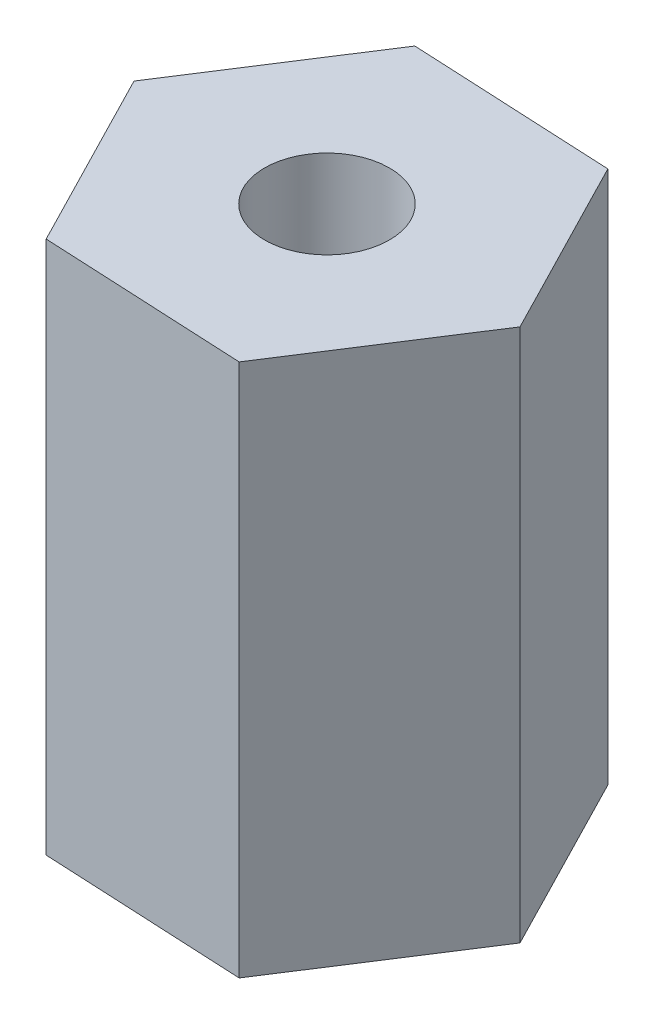
ISO-10303-21;
HEADER;
FILE_DESCRIPTION(('STEP AP214'),'2;1');
FILE_NAME('part.step','',(''),(''),'','','');
FILE_SCHEMA(('AUTOMOTIVE_DESIGN { 1 0 10303 214 1 1 1 1 }'));
ENDSEC;
DATA;
#1=APPLICATION_CONTEXT('core data for automotive mechanical design processes');
#2=APPLICATION_PROTOCOL_DEFINITION('international standard','automotive_design',2000,#1);
#3=PRODUCT_CONTEXT('',#1,'mechanical');
#4=PRODUCT('Part','Part','',(#3));
#5=PRODUCT_RELATED_PRODUCT_CATEGORY('part','',(#4));
#6=PRODUCT_DEFINITION_FORMATION('','',#4);
#7=PRODUCT_DEFINITION_CONTEXT('part definition',#1,'design');
#8=PRODUCT_DEFINITION('design','',#6,#7);
#9=PRODUCT_DEFINITION_SHAPE('','',#8);
#10=(LENGTH_UNIT() NAMED_UNIT(*) SI_UNIT(.MILLI.,.METRE.));
#11=(NAMED_UNIT(*) PLANE_ANGLE_UNIT() SI_UNIT($,.RADIAN.));
#12=(NAMED_UNIT(*) SI_UNIT($,.STERADIAN.) SOLID_ANGLE_UNIT());
#13=UNCERTAINTY_MEASURE_WITH_UNIT(LENGTH_MEASURE(1.E-05),#10,'distance_accuracy_value','');
#14=(GEOMETRIC_REPRESENTATION_CONTEXT(3) GLOBAL_UNCERTAINTY_ASSIGNED_CONTEXT((#13)) GLOBAL_UNIT_ASSIGNED_CONTEXT((#10,
#11,#12)) REPRESENTATION_CONTEXT('',''));
#15=CARTESIAN_POINT('',(0.,0.,0.));
#16=DIRECTION('',(0.,0.,1.));
#17=DIRECTION('',(1.,0.,0.));
#18=AXIS2_PLACEMENT_3D('',#15,#16,#17);
#19=CARTESIAN_POINT('',(1.93898368371843,9.4,-3.00893263593705));
#20=DIRECTION('',(-0.0488166813838843,0.,0.998807755085364));
#21=DIRECTION('',(0.998807755085364,0.,0.0488166813838843));
#22=AXIS2_PLACEMENT_3D('',#19,#20,#21);
#23=PLANE('',#22);
#24=DIRECTION('',(-0.998807755085364,0.,-0.0488166813838843));
#25=VECTOR('',#24,1.);
#26=CARTESIAN_POINT('',(1.93898368371843,0.,-3.00893263593705));
#27=LINE('',#26,#25);
#28=CARTESIAN_POINT('',(1.93898368371843,0.,-3.00893263593705));
#29=VERTEX_POINT('',#28);
#30=CARTESIAN_POINT('',(-1.63632025913834,0.,-3.18367544559221));
#31=VERTEX_POINT('',#30);
#32=EDGE_CURVE('E117',#29,#31,#27,.T.);
#33=ORIENTED_EDGE('',*,*,#32,.T.);
#34=DIRECTION('',(0.,-1.,0.));
#35=VECTOR('',#34,1.);
#36=CARTESIAN_POINT('',(-1.63632025913834,9.4,-3.18367544559221));
#37=LINE('',#36,#35);
#38=CARTESIAN_POINT('',(-1.63632025913834,9.4,-3.18367544559221));
#39=VERTEX_POINT('',#38);
#40=EDGE_CURVE('E11',#39,#31,#37,.T.);
#41=ORIENTED_EDGE('',*,*,#40,.F.);
#42=DIRECTION('',(-0.998807755085364,0.,-0.0488166813838843));
#43=VECTOR('',#42,1.);
#44=CARTESIAN_POINT('',(1.93898368371843,9.4,-3.00893263593705));
#45=LINE('',#44,#43);
#46=CARTESIAN_POINT('',(1.93898368371843,9.4,-3.00893263593705));
#47=VERTEX_POINT('',#46);
#48=EDGE_CURVE('E128',#47,#39,#45,.T.);
#49=ORIENTED_EDGE('',*,*,#48,.F.);
#50=DIRECTION('',(0.,-1.,0.));
#51=VECTOR('',#50,1.);
#52=CARTESIAN_POINT('',(1.93898368371843,9.4,-3.00893263593705));
#53=LINE('',#52,#51);
#54=EDGE_CURVE('E113',#47,#29,#53,.T.);
#55=ORIENTED_EDGE('',*,*,#54,.T.);
#56=EDGE_LOOP('',(#33,#41,#49,#55));
#57=FACE_BOUND('',#56,.T.);
#58=ADVANCED_FACE('F33',(#57),#23,.F.);
#59=CARTESIAN_POINT('',(-1.63632025913834,9.4,-3.18367544559221));
#60=DIRECTION('',(0.840584548708889,0.,0.541680363749577));
#61=DIRECTION('',(0.541680363749577,0.,-0.840584548708889));
#62=AXIS2_PLACEMENT_3D('',#59,#60,#61);
#63=PLANE('',#62);
#64=DIRECTION('',(-0.541680363749577,0.,0.840584548708889));
#65=VECTOR('',#64,1.);
#66=CARTESIAN_POINT('',(-1.63632025913834,0.,-3.18367544559221));
#67=LINE('',#66,#65);
#68=CARTESIAN_POINT('',(-3.57530394285677,0.,-0.174742809655165));
#69=VERTEX_POINT('',#68);
#70=EDGE_CURVE('E120',#31,#69,#67,.T.);
#71=ORIENTED_EDGE('',*,*,#70,.T.);
#72=DIRECTION('',(0.,-1.,0.));
#73=VECTOR('',#72,1.);
#74=CARTESIAN_POINT('',(-3.57530394285677,9.4,-0.174742809655165));
#75=LINE('',#74,#73);
#76=CARTESIAN_POINT('',(-3.57530394285677,9.4,-0.174742809655165));
#77=VERTEX_POINT('',#76);
#78=EDGE_CURVE('E41',#77,#69,#75,.T.);
#79=ORIENTED_EDGE('',*,*,#78,.F.);
#80=DIRECTION('',(-0.541680363749577,0.,0.840584548708889));
#81=VECTOR('',#80,1.);
#82=CARTESIAN_POINT('',(-1.63632025913834,9.4,-3.18367544559221));
#83=LINE('',#82,#81);
#84=EDGE_CURVE('E86',#39,#77,#83,.T.);
#85=ORIENTED_EDGE('',*,*,#84,.F.);
#86=ORIENTED_EDGE('',*,*,#40,.T.);
#87=EDGE_LOOP('',(#71,#79,#85,#86));
#88=FACE_BOUND('',#87,.T.);
#89=ADVANCED_FACE('F153',(#88),#63,.F.);
#90=CARTESIAN_POINT('',(-3.57530394285677,9.4,-0.174742809655165));
#91=DIRECTION('',(0.889401230092773,0.,-0.457127391335787));
#92=DIRECTION('',(-0.457127391335787,0.,-0.889401230092773));
#93=AXIS2_PLACEMENT_3D('',#90,#91,#92);
#94=PLANE('',#93);
#95=DIRECTION('',(0.457127391335787,0.,0.889401230092773));
#96=VECTOR('',#95,1.);
#97=CARTESIAN_POINT('',(-3.57530394285677,0.,-0.174742809655165));
#98=LINE('',#97,#96);
#99=CARTESIAN_POINT('',(-1.93898368371843,0.,3.00893263593705));
#100=VERTEX_POINT('',#99);
#101=EDGE_CURVE('E123',#69,#100,#98,.T.);
#102=ORIENTED_EDGE('',*,*,#101,.T.);
#103=DIRECTION('',(0.,-1.,0.));
#104=VECTOR('',#103,1.);
#105=CARTESIAN_POINT('',(-1.93898368371843,9.4,3.00893263593705));
#106=LINE('',#105,#104);
#107=CARTESIAN_POINT('',(-1.93898368371843,9.4,3.00893263593705));
#108=VERTEX_POINT('',#107);
#109=EDGE_CURVE('E108',#108,#100,#106,.T.);
#110=ORIENTED_EDGE('',*,*,#109,.F.);
#111=DIRECTION('',(0.457127391335787,0.,0.889401230092773));
#112=VECTOR('',#111,1.);
#113=CARTESIAN_POINT('',(-3.57530394285677,9.4,-0.174742809655165));
#114=LINE('',#113,#112);
#115=EDGE_CURVE('E99',#77,#108,#114,.T.);
#116=ORIENTED_EDGE('',*,*,#115,.F.);
#117=ORIENTED_EDGE('',*,*,#78,.T.);
#118=EDGE_LOOP('',(#102,#110,#116,#117));
#119=FACE_BOUND('',#118,.T.);
#120=ADVANCED_FACE('F134',(#119),#94,.F.);
#121=CARTESIAN_POINT('',(-1.93898368371843,9.4,3.00893263593705));
#122=DIRECTION('',(0.0488166813838845,0.,-0.998807755085364));
#123=DIRECTION('',(-0.998807755085364,0.,-0.0488166813838845));
#124=AXIS2_PLACEMENT_3D('',#121,#122,#123);
#125=PLANE('',#124);
#126=DIRECTION('',(0.998807755085364,0.,0.0488166813838845));
#127=VECTOR('',#126,1.);
#128=CARTESIAN_POINT('',(-1.93898368371843,0.,3.00893263593705));
#129=LINE('',#128,#127);
#130=CARTESIAN_POINT('',(1.63632025913834,0.,3.18367544559221));
#131=VERTEX_POINT('',#130);
#132=EDGE_CURVE('E107',#100,#131,#129,.T.);
#133=ORIENTED_EDGE('',*,*,#132,.T.);
#134=DIRECTION('',(0.,-1.,0.));
#135=VECTOR('',#134,1.);
#136=CARTESIAN_POINT('',(1.63632025913834,9.4,3.18367544559221));
#137=LINE('',#136,#135);
#138=CARTESIAN_POINT('',(1.63632025913834,9.4,3.18367544559221));
#139=VERTEX_POINT('',#138);
#140=EDGE_CURVE('E104',#139,#131,#137,.T.);
#141=ORIENTED_EDGE('',*,*,#140,.F.);
#142=DIRECTION('',(0.998807755085364,0.,0.0488166813838845));
#143=VECTOR('',#142,1.);
#144=CARTESIAN_POINT('',(-1.93898368371843,9.4,3.00893263593705));
#145=LINE('',#144,#143);
#146=EDGE_CURVE('E93',#108,#139,#145,.T.);
#147=ORIENTED_EDGE('',*,*,#146,.F.);
#148=ORIENTED_EDGE('',*,*,#109,.T.);
#149=EDGE_LOOP('',(#133,#141,#147,#148));
#150=FACE_BOUND('',#149,.T.);
#151=ADVANCED_FACE('F105',(#150),#125,.F.);
#152=CARTESIAN_POINT('',(1.63632025913834,9.4,3.18367544559221));
#153=DIRECTION('',(-0.840584548708889,0.,-0.541680363749577));
#154=DIRECTION('',(-0.541680363749577,0.,0.840584548708889));
#155=AXIS2_PLACEMENT_3D('',#152,#153,#154);
#156=PLANE('',#155);
#157=DIRECTION('',(0.541680363749577,0.,-0.840584548708889));
#158=VECTOR('',#157,1.);
#159=CARTESIAN_POINT('',(1.63632025913834,0.,3.18367544559221));
#160=LINE('',#159,#158);
#161=CARTESIAN_POINT('',(3.57530394285677,0.,0.174742809655165));
#162=VERTEX_POINT('',#161);
#163=EDGE_CURVE('E72',#131,#162,#160,.T.);
#164=ORIENTED_EDGE('',*,*,#163,.T.);
#165=DIRECTION('',(0.,-1.,0.));
#166=VECTOR('',#165,1.);
#167=CARTESIAN_POINT('',(3.57530394285677,9.4,0.174742809655165));
#168=LINE('',#167,#166);
#169=CARTESIAN_POINT('',(3.57530394285677,9.4,0.174742809655165));
#170=VERTEX_POINT('',#169);
#171=EDGE_CURVE('E109',#170,#162,#168,.T.);
#172=ORIENTED_EDGE('',*,*,#171,.F.);
#173=DIRECTION('',(0.541680363749577,0.,-0.840584548708889));
#174=VECTOR('',#173,1.);
#175=CARTESIAN_POINT('',(1.63632025913834,9.4,3.18367544559221));
#176=LINE('',#175,#174);
#177=EDGE_CURVE('E97',#139,#170,#176,.T.);
#178=ORIENTED_EDGE('',*,*,#177,.F.);
#179=ORIENTED_EDGE('',*,*,#140,.T.);
#180=EDGE_LOOP('',(#164,#172,#178,#179));
#181=FACE_BOUND('',#180,.T.);
#182=ADVANCED_FACE('F111',(#181),#156,.F.);
#183=CARTESIAN_POINT('',(3.57530394285677,9.4,0.174742809655165));
#184=DIRECTION('',(-0.889401230092773,0.,0.457127391335787));
#185=DIRECTION('',(0.457127391335787,0.,0.889401230092773));
#186=AXIS2_PLACEMENT_3D('',#183,#184,#185);
#187=PLANE('',#186);
#188=DIRECTION('',(-0.457127391335787,0.,-0.889401230092773));
#189=VECTOR('',#188,1.);
#190=CARTESIAN_POINT('',(3.57530394285677,0.,0.174742809655165));
#191=LINE('',#190,#189);
#192=EDGE_CURVE('E78',#162,#29,#191,.T.);
#193=ORIENTED_EDGE('',*,*,#192,.T.);
#194=ORIENTED_EDGE('',*,*,#54,.F.);
#195=DIRECTION('',(-0.457127391335787,0.,-0.889401230092773));
#196=VECTOR('',#195,1.);
#197=CARTESIAN_POINT('',(3.57530394285677,9.4,0.174742809655165));
#198=LINE('',#197,#196);
#199=EDGE_CURVE('E49',#170,#47,#198,.T.);
#200=ORIENTED_EDGE('',*,*,#199,.F.);
#201=ORIENTED_EDGE('',*,*,#171,.T.);
#202=EDGE_LOOP('',(#193,#194,#200,#201));
#203=FACE_BOUND('',#202,.T.);
#204=ADVANCED_FACE('F141',(#203),#187,.F.);
#205=CARTESIAN_POINT('',(0.,9.4,0.));
#206=DIRECTION('',(0.,1.,0.));
#207=DIRECTION('',(0.,0.,1.));
#208=AXIS2_PLACEMENT_3D('',#205,#206,#207);
#209=PLANE('',#208);
#210=CARTESIAN_POINT('',(0.,9.4,0.));
#211=DIRECTION('',(0.,-1.,0.));
#212=DIRECTION('',(0.,0.,-1.));
#213=AXIS2_PLACEMENT_3D('',#210,#211,#212);
#214=CIRCLE('',#213,1.1);
#215=CARTESIAN_POINT('',(0.,9.4,-1.1));
#216=VERTEX_POINT('',#215);
#217=EDGE_CURVE('E121',#216,#216,#214,.T.);
#218=ORIENTED_EDGE('',*,*,#217,.T.);
#219=EDGE_LOOP('',(#218));
#220=FACE_BOUND('',#219,.T.);
#221=ORIENTED_EDGE('',*,*,#48,.T.);
#222=ORIENTED_EDGE('',*,*,#84,.T.);
#223=ORIENTED_EDGE('',*,*,#115,.T.);
#224=ORIENTED_EDGE('',*,*,#146,.T.);
#225=ORIENTED_EDGE('',*,*,#177,.T.);
#226=ORIENTED_EDGE('',*,*,#199,.T.);
#227=EDGE_LOOP('',(#221,#222,#223,#224,#225,#226));
#228=FACE_BOUND('',#227,.T.);
#229=ADVANCED_FACE('F95',(#220,#228),#209,.T.);
#230=CARTESIAN_POINT('',(0.,0.,0.));
#231=DIRECTION('',(0.,1.,0.));
#232=DIRECTION('',(0.,0.,1.));
#233=AXIS2_PLACEMENT_3D('',#230,#231,#232);
#234=PLANE('',#233);
#235=CARTESIAN_POINT('',(0.,0.,0.));
#236=DIRECTION('',(0.,-1.,0.));
#237=DIRECTION('',(0.,0.,-1.));
#238=AXIS2_PLACEMENT_3D('',#235,#236,#237);
#239=CIRCLE('',#238,1.1);
#240=CARTESIAN_POINT('',(0.,0.,-1.1));
#241=VERTEX_POINT('',#240);
#242=EDGE_CURVE('E208',#241,#241,#239,.T.);
#243=ORIENTED_EDGE('',*,*,#242,.F.);
#244=EDGE_LOOP('',(#243));
#245=FACE_BOUND('',#244,.T.);
#246=ORIENTED_EDGE('',*,*,#32,.F.);
#247=ORIENTED_EDGE('',*,*,#192,.F.);
#248=ORIENTED_EDGE('',*,*,#163,.F.);
#249=ORIENTED_EDGE('',*,*,#132,.F.);
#250=ORIENTED_EDGE('',*,*,#101,.F.);
#251=ORIENTED_EDGE('',*,*,#70,.F.);
#252=EDGE_LOOP('',(#246,#247,#248,#249,#250,#251));
#253=FACE_BOUND('',#252,.T.);
#254=ADVANCED_FACE('F137',(#245,#253),#234,.F.);
#255=CARTESIAN_POINT('',(0.,9.4,0.));
#256=DIRECTION('',(0.,-1.,0.));
#257=DIRECTION('',(0.,0.,-1.));
#258=AXIS2_PLACEMENT_3D('',#255,#256,#257);
#259=CYLINDRICAL_SURFACE('',#258,1.1);
#260=ORIENTED_EDGE('',*,*,#217,.F.);
#261=EDGE_LOOP('',(#260));
#262=FACE_BOUND('',#261,.T.);
#263=ORIENTED_EDGE('',*,*,#242,.T.);
#264=EDGE_LOOP('',(#263));
#265=FACE_BOUND('',#264,.T.);
#266=ADVANCED_FACE('F190',(#262,#265),#259,.F.);
#267=CLOSED_SHELL('',(#58,#89,#120,#151,#182,#204,#229,#254,#266));
#268=MANIFOLD_SOLID_BREP('B2',#267);
#269=ADVANCED_BREP_SHAPE_REPRESENTATION('',(#18,#268),#14);
#270=SHAPE_DEFINITION_REPRESENTATION(#9,#269);
ENDSEC;
END-ISO-10303-21;
